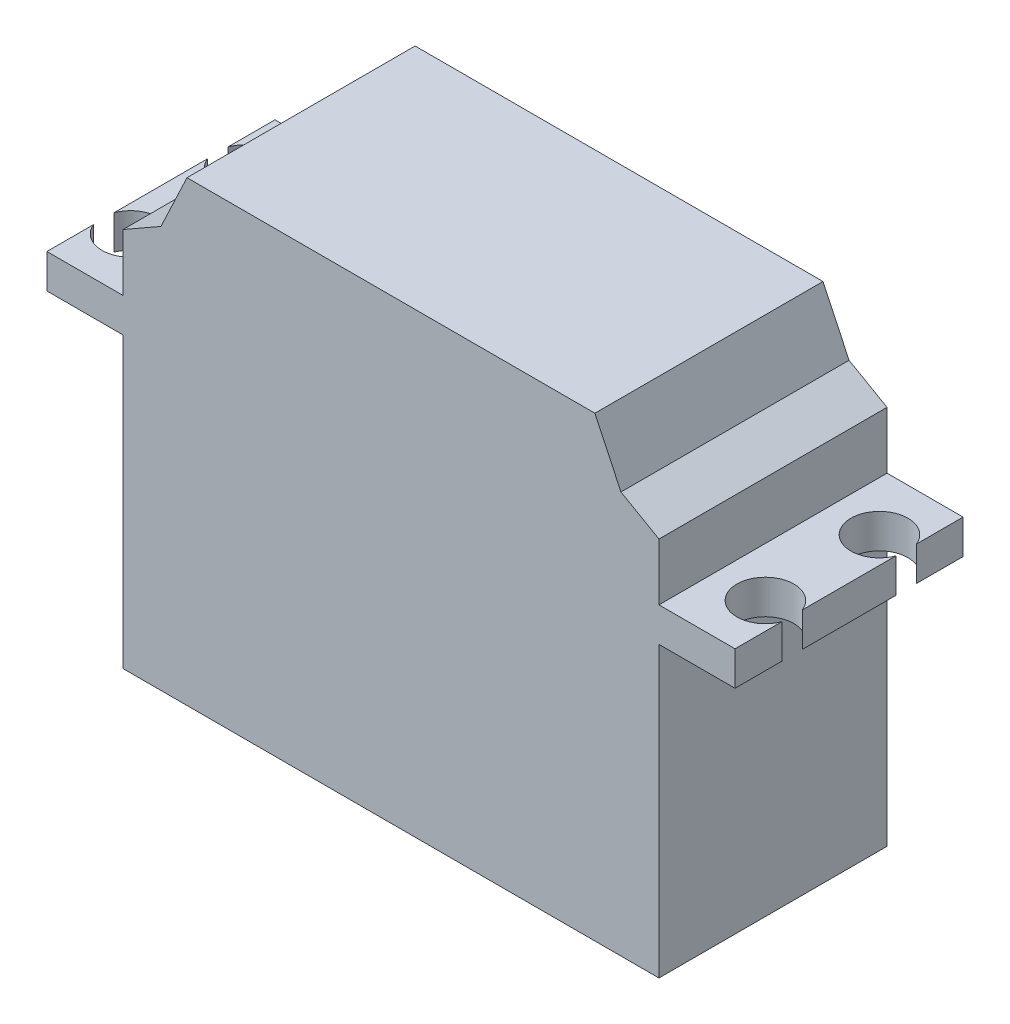
ISO-10303-21;
HEADER;
FILE_DESCRIPTION(('STEP AP214'),'2;1');
FILE_NAME('part.step','',(''),(''),'','','');
FILE_SCHEMA(('AUTOMOTIVE_DESIGN { 1 0 10303 214 1 1 1 1 }'));
ENDSEC;
DATA;
#1=APPLICATION_CONTEXT('core data for automotive mechanical design processes');
#2=APPLICATION_PROTOCOL_DEFINITION('international standard','automotive_design',2000,#1);
#3=PRODUCT_CONTEXT('',#1,'mechanical');
#4=PRODUCT('Part','Part','',(#3));
#5=PRODUCT_RELATED_PRODUCT_CATEGORY('part','',(#4));
#6=PRODUCT_DEFINITION_FORMATION('','',#4);
#7=PRODUCT_DEFINITION_CONTEXT('part definition',#1,'design');
#8=PRODUCT_DEFINITION('design','',#6,#7);
#9=PRODUCT_DEFINITION_SHAPE('','',#8);
#10=(LENGTH_UNIT() NAMED_UNIT(*) SI_UNIT(.MILLI.,.METRE.));
#11=(NAMED_UNIT(*) PLANE_ANGLE_UNIT() SI_UNIT($,.RADIAN.));
#12=(NAMED_UNIT(*) SI_UNIT($,.STERADIAN.) SOLID_ANGLE_UNIT());
#13=UNCERTAINTY_MEASURE_WITH_UNIT(LENGTH_MEASURE(1.E-05),#10,'distance_accuracy_value','');
#14=(GEOMETRIC_REPRESENTATION_CONTEXT(3) GLOBAL_UNCERTAINTY_ASSIGNED_CONTEXT((#13)) GLOBAL_UNIT_ASSIGNED_CONTEXT((#10,
#11,#12)) REPRESENTATION_CONTEXT('',''));
#15=CARTESIAN_POINT('',(0.,0.,0.));
#16=DIRECTION('',(0.,0.,1.));
#17=DIRECTION('',(1.,0.,0.));
#18=AXIS2_PLACEMENT_3D('',#15,#16,#17);
#19=CARTESIAN_POINT('',(-22.987,19.304,-13.1906548986632));
#20=DIRECTION('',(-1.,0.,0.));
#21=DIRECTION('',(0.,0.,1.));
#22=AXIS2_PLACEMENT_3D('',#19,#20,#21);
#23=PLANE('',#22);
#24=DIRECTION('',(0.,1.,0.));
#25=VECTOR('',#24,1.);
#26=CARTESIAN_POINT('',(-22.987,13.9158463273585,4.49391593050608));
#27=LINE('',#26,#25);
#28=CARTESIAN_POINT('',(-22.987,19.304,4.49391593050608));
#29=VERTEX_POINT('',#28);
#30=CARTESIAN_POINT('',(-22.987,21.59,4.49391593050608));
#31=VERTEX_POINT('',#30);
#32=EDGE_CURVE('E11',#29,#31,#27,.T.);
#33=ORIENTED_EDGE('',*,*,#32,.F.);
#34=DIRECTION('',(0.,0.,1.));
#35=VECTOR('',#34,1.);
#36=CARTESIAN_POINT('',(-22.987,19.304,-13.1906548986632));
#37=LINE('',#36,#35);
#38=CARTESIAN_POINT('',(-22.987,19.304,7.62));
#39=VERTEX_POINT('',#38);
#40=EDGE_CURVE('E261',#29,#39,#37,.T.);
#41=ORIENTED_EDGE('',*,*,#40,.T.);
#42=DIRECTION('',(0.,-1.,0.));
#43=VECTOR('',#42,1.);
#44=CARTESIAN_POINT('',(-22.987,19.304,7.62));
#45=LINE('',#44,#43);
#46=CARTESIAN_POINT('',(-22.987,21.59,7.62));
#47=VERTEX_POINT('',#46);
#48=EDGE_CURVE('E246',#47,#39,#45,.T.);
#49=ORIENTED_EDGE('',*,*,#48,.F.);
#50=DIRECTION('',(0.,0.,1.));
#51=VECTOR('',#50,1.);
#52=CARTESIAN_POINT('',(-22.987,21.59,-13.1906548986632));
#53=LINE('',#52,#51);
#54=EDGE_CURVE('E252',#31,#47,#53,.T.);
#55=ORIENTED_EDGE('',*,*,#54,.F.);
#56=EDGE_LOOP('',(#33,#41,#49,#55));
#57=FACE_BOUND('',#56,.T.);
#58=ADVANCED_FACE('F36',(#57),#23,.T.);
#59=DIRECTION('',(0.,1.,0.));
#60=VECTOR('',#59,1.);
#61=CARTESIAN_POINT('',(-22.987,13.9158463273585,3.12608406949392));
#62=LINE('',#61,#60);
#63=CARTESIAN_POINT('',(-22.987,21.59,3.12608406949392));
#64=VERTEX_POINT('',#63);
#65=CARTESIAN_POINT('',(-22.987,19.304,3.12608406949392));
#66=VERTEX_POINT('',#65);
#67=EDGE_CURVE('E44',#64,#66,#62,.F.);
#68=ORIENTED_EDGE('',*,*,#67,.F.);
#69=CARTESIAN_POINT('',(-22.987,21.59,-3.12608406949391));
#70=VERTEX_POINT('',#69);
#71=EDGE_CURVE('E265',#70,#64,#53,.T.);
#72=ORIENTED_EDGE('',*,*,#71,.F.);
#73=DIRECTION('',(0.,1.,0.));
#74=VECTOR('',#73,1.);
#75=CARTESIAN_POINT('',(-22.987,13.9158463273585,-3.12608406949391));
#76=LINE('',#75,#74);
#77=CARTESIAN_POINT('',(-22.987,19.304,-3.12608406949391));
#78=VERTEX_POINT('',#77);
#79=EDGE_CURVE('E340',#78,#70,#76,.T.);
#80=ORIENTED_EDGE('',*,*,#79,.F.);
#81=EDGE_CURVE('E260',#78,#66,#37,.T.);
#82=ORIENTED_EDGE('',*,*,#81,.T.);
#83=EDGE_LOOP('',(#68,#72,#80,#82));
#84=FACE_BOUND('',#83,.T.);
#85=ADVANCED_FACE('F356',(#84),#23,.T.);
#86=CARTESIAN_POINT('',(22.987,19.304,-13.1906548986632));
#87=DIRECTION('',(1.,0.,0.));
#88=DIRECTION('',(0.,0.,-1.));
#89=AXIS2_PLACEMENT_3D('',#86,#87,#88);
#90=PLANE('',#89);
#91=DIRECTION('',(0.,1.,0.));
#92=VECTOR('',#91,1.);
#93=CARTESIAN_POINT('',(22.987,13.9158463273585,-4.4939159305061));
#94=LINE('',#93,#92);
#95=CARTESIAN_POINT('',(22.987,19.304,-4.4939159305061));
#96=VERTEX_POINT('',#95);
#97=CARTESIAN_POINT('',(22.987,21.59,-4.4939159305061));
#98=VERTEX_POINT('',#97);
#99=EDGE_CURVE('E336',#96,#98,#94,.T.);
#100=ORIENTED_EDGE('',*,*,#99,.F.);
#101=DIRECTION('',(0.,0.,1.));
#102=VECTOR('',#101,1.);
#103=CARTESIAN_POINT('',(22.987,19.304,-13.1906548986632));
#104=LINE('',#103,#102);
#105=CARTESIAN_POINT('',(22.987,19.304,-7.62));
#106=VERTEX_POINT('',#105);
#107=EDGE_CURVE('E225',#106,#96,#104,.T.);
#108=ORIENTED_EDGE('',*,*,#107,.F.);
#109=DIRECTION('',(0.,-1.,0.));
#110=VECTOR('',#109,1.);
#111=CARTESIAN_POINT('',(22.987,19.304,-7.62));
#112=LINE('',#111,#110);
#113=CARTESIAN_POINT('',(22.987,21.59,-7.62));
#114=VERTEX_POINT('',#113);
#115=EDGE_CURVE('E233',#114,#106,#112,.T.);
#116=ORIENTED_EDGE('',*,*,#115,.F.);
#117=DIRECTION('',(0.,0.,1.));
#118=VECTOR('',#117,1.);
#119=CARTESIAN_POINT('',(22.987,21.59,-13.1906548986632));
#120=LINE('',#119,#118);
#121=EDGE_CURVE('E221',#114,#98,#120,.T.);
#122=ORIENTED_EDGE('',*,*,#121,.T.);
#123=EDGE_LOOP('',(#100,#108,#116,#122));
#124=FACE_BOUND('',#123,.T.);
#125=ADVANCED_FACE('F418',(#124),#90,.T.);
#126=DIRECTION('',(0.,1.,0.));
#127=VECTOR('',#126,1.);
#128=CARTESIAN_POINT('',(22.987,13.9158463273585,-3.12608406949393));
#129=LINE('',#128,#127);
#130=CARTESIAN_POINT('',(22.987,21.59,-3.12608406949393));
#131=VERTEX_POINT('',#130);
#132=CARTESIAN_POINT('',(22.987,19.304,-3.12608406949393));
#133=VERTEX_POINT('',#132);
#134=EDGE_CURVE('E206',#131,#133,#129,.F.);
#135=ORIENTED_EDGE('',*,*,#134,.F.);
#136=CARTESIAN_POINT('',(22.987,21.59,3.12608406949391));
#137=VERTEX_POINT('',#136);
#138=EDGE_CURVE('E214',#131,#137,#120,.T.);
#139=ORIENTED_EDGE('',*,*,#138,.T.);
#140=DIRECTION('',(0.,1.,0.));
#141=VECTOR('',#140,1.);
#142=CARTESIAN_POINT('',(22.987,13.9158463273585,3.12608406949391));
#143=LINE('',#142,#141);
#144=CARTESIAN_POINT('',(22.987,19.304,3.12608406949391));
#145=VERTEX_POINT('',#144);
#146=EDGE_CURVE('E195',#145,#137,#143,.T.);
#147=ORIENTED_EDGE('',*,*,#146,.F.);
#148=EDGE_CURVE('E231',#133,#145,#104,.T.);
#149=ORIENTED_EDGE('',*,*,#148,.F.);
#150=EDGE_LOOP('',(#135,#139,#147,#149));
#151=FACE_BOUND('',#150,.T.);
#152=ADVANCED_FACE('F220',(#151),#90,.T.);
#153=CARTESIAN_POINT('',(17.907,25.4,-7.62));
#154=DIRECTION('',(-1.,0.,0.));
#155=DIRECTION('',(0.,0.,1.));
#156=AXIS2_PLACEMENT_3D('',#153,#154,#155);
#157=PLANE('',#156);
#158=DIRECTION('',(0.,0.,1.));
#159=VECTOR('',#158,1.);
#160=CARTESIAN_POINT('',(17.907,21.59,-13.1906548986632));
#161=LINE('',#160,#159);
#162=CARTESIAN_POINT('',(17.907,21.59,-7.62));
#163=VERTEX_POINT('',#162);
#164=CARTESIAN_POINT('',(17.907,21.59,7.62));
#165=VERTEX_POINT('',#164);
#166=EDGE_CURVE('E224',#163,#165,#161,.T.);
#167=ORIENTED_EDGE('',*,*,#166,.F.);
#168=DIRECTION('',(0.,-1.,0.));
#169=VECTOR('',#168,1.);
#170=CARTESIAN_POINT('',(17.907,25.4,-7.62));
#171=LINE('',#170,#169);
#172=CARTESIAN_POINT('',(17.907,25.4,-7.62));
#173=VERTEX_POINT('',#172);
#174=EDGE_CURVE('E331',#173,#163,#171,.T.);
#175=ORIENTED_EDGE('',*,*,#174,.F.);
#176=DIRECTION('',(0.,0.,-1.));
#177=VECTOR('',#176,1.);
#178=CARTESIAN_POINT('',(17.907,25.4,-7.62));
#179=LINE('',#178,#177);
#180=CARTESIAN_POINT('',(17.907,25.4,7.62));
#181=VERTEX_POINT('',#180);
#182=EDGE_CURVE('E303',#181,#173,#179,.T.);
#183=ORIENTED_EDGE('',*,*,#182,.F.);
#184=DIRECTION('',(0.,-1.,0.));
#185=VECTOR('',#184,1.);
#186=CARTESIAN_POINT('',(17.907,25.4,7.62));
#187=LINE('',#186,#185);
#188=EDGE_CURVE('E321',#181,#165,#187,.T.);
#189=ORIENTED_EDGE('',*,*,#188,.T.);
#190=EDGE_LOOP('',(#167,#175,#183,#189));
#191=FACE_BOUND('',#190,.T.);
#192=ADVANCED_FACE('F422',(#191),#157,.F.);
#193=CARTESIAN_POINT('',(-17.907,25.4,-7.62));
#194=DIRECTION('',(1.,0.,0.));
#195=DIRECTION('',(0.,0.,-1.));
#196=AXIS2_PLACEMENT_3D('',#193,#194,#195);
#197=PLANE('',#196);
#198=DIRECTION('',(0.,0.,1.));
#199=VECTOR('',#198,1.);
#200=CARTESIAN_POINT('',(-17.907,19.304,-13.1906548986632));
#201=LINE('',#200,#199);
#202=CARTESIAN_POINT('',(-17.907,19.304,-7.62));
#203=VERTEX_POINT('',#202);
#204=CARTESIAN_POINT('',(-17.907,19.304,7.62));
#205=VERTEX_POINT('',#204);
#206=EDGE_CURVE('E254',#203,#205,#201,.T.);
#207=ORIENTED_EDGE('',*,*,#206,.F.);
#208=DIRECTION('',(0.,-1.,0.));
#209=VECTOR('',#208,1.);
#210=CARTESIAN_POINT('',(-17.907,25.4,-7.62));
#211=LINE('',#210,#209);
#212=CARTESIAN_POINT('',(-17.907,0.,-7.62));
#213=VERTEX_POINT('',#212);
#214=EDGE_CURVE('E327',#203,#213,#211,.T.);
#215=ORIENTED_EDGE('',*,*,#214,.T.);
#216=DIRECTION('',(0.,0.,1.));
#217=VECTOR('',#216,1.);
#218=CARTESIAN_POINT('',(-17.907,0.,-7.62));
#219=LINE('',#218,#217);
#220=CARTESIAN_POINT('',(-17.907,0.,7.62));
#221=VERTEX_POINT('',#220);
#222=EDGE_CURVE('E316',#213,#221,#219,.T.);
#223=ORIENTED_EDGE('',*,*,#222,.T.);
#224=DIRECTION('',(0.,-1.,0.));
#225=VECTOR('',#224,1.);
#226=CARTESIAN_POINT('',(-17.907,25.4,7.62));
#227=LINE('',#226,#225);
#228=EDGE_CURVE('E323',#205,#221,#227,.T.);
#229=ORIENTED_EDGE('',*,*,#228,.F.);
#230=EDGE_LOOP('',(#207,#215,#223,#229));
#231=FACE_BOUND('',#230,.T.);
#232=ADVANCED_FACE('F454',(#231),#197,.F.);
#233=CARTESIAN_POINT('',(17.907,19.304,-7.62));
#234=VERTEX_POINT('',#233);
#235=CARTESIAN_POINT('',(17.907,0.,-7.62));
#236=VERTEX_POINT('',#235);
#237=EDGE_CURVE('E330',#234,#236,#171,.T.);
#238=ORIENTED_EDGE('',*,*,#237,.F.);
#239=DIRECTION('',(0.,0.,1.));
#240=VECTOR('',#239,1.);
#241=CARTESIAN_POINT('',(17.907,19.304,-13.1906548986632));
#242=LINE('',#241,#240);
#243=CARTESIAN_POINT('',(17.907,19.304,7.62));
#244=VERTEX_POINT('',#243);
#245=EDGE_CURVE('E381',#234,#244,#242,.T.);
#246=ORIENTED_EDGE('',*,*,#245,.T.);
#247=CARTESIAN_POINT('',(17.907,0.,7.62));
#248=VERTEX_POINT('',#247);
#249=EDGE_CURVE('E310',#244,#248,#187,.T.);
#250=ORIENTED_EDGE('',*,*,#249,.T.);
#251=DIRECTION('',(0.,0.,-1.));
#252=VECTOR('',#251,1.);
#253=CARTESIAN_POINT('',(17.907,0.,-7.62));
#254=LINE('',#253,#252);
#255=EDGE_CURVE('E302',#248,#236,#254,.T.);
#256=ORIENTED_EDGE('',*,*,#255,.T.);
#257=EDGE_LOOP('',(#238,#246,#250,#256));
#258=FACE_BOUND('',#257,.T.);
#259=ADVANCED_FACE('F38',(#258),#157,.F.);
#260=CARTESIAN_POINT('',(-17.907,25.4,-7.62));
#261=DIRECTION('',(0.,0.,1.));
#262=DIRECTION('',(1.,0.,0.));
#263=AXIS2_PLACEMENT_3D('',#260,#261,#262);
#264=PLANE('',#263);
#265=DIRECTION('',(0.868243142124459,0.496138938356834,0.));
#266=VECTOR('',#265,1.);
#267=CARTESIAN_POINT('',(-17.907,25.4,-7.62));
#268=LINE('',#267,#266);
#269=CARTESIAN_POINT('',(-17.907,25.4,-7.62));
#270=VERTEX_POINT('',#269);
#271=CARTESIAN_POINT('',(-15.367,26.8514285714286,-7.62));
#272=VERTEX_POINT('',#271);
#273=EDGE_CURVE('E293',#270,#272,#268,.T.);
#274=ORIENTED_EDGE('',*,*,#273,.T.);
#275=DIRECTION('',(0.426649540613449,0.90441703295235,0.));
#276=VECTOR('',#275,1.);
#277=CARTESIAN_POINT('',(-15.367,26.8514285714286,-7.62));
#278=LINE('',#277,#276);
#279=CARTESIAN_POINT('',(-13.6268844552524,30.5401472694776,-7.62));
#280=VERTEX_POINT('',#279);
#281=EDGE_CURVE('E274',#272,#280,#278,.T.);
#282=ORIENTED_EDGE('',*,*,#281,.T.);
#283=DIRECTION('',(1.,0.,0.));
#284=VECTOR('',#283,1.);
#285=CARTESIAN_POINT('',(-13.6268844552524,30.5401472694776,-7.62));
#286=LINE('',#285,#284);
#287=CARTESIAN_POINT('',(13.6268844552524,30.5401472694776,-7.62));
#288=VERTEX_POINT('',#287);
#289=EDGE_CURVE('E271',#280,#288,#286,.T.);
#290=ORIENTED_EDGE('',*,*,#289,.T.);
#291=DIRECTION('',(0.426649540613449,-0.90441703295235,0.));
#292=VECTOR('',#291,1.);
#293=CARTESIAN_POINT('',(15.367,26.8514285714286,-7.62));
#294=LINE('',#293,#292);
#295=CARTESIAN_POINT('',(15.367,26.8514285714286,-7.62));
#296=VERTEX_POINT('',#295);
#297=EDGE_CURVE('E268',#288,#296,#294,.T.);
#298=ORIENTED_EDGE('',*,*,#297,.T.);
#299=DIRECTION('',(0.868243142124459,-0.496138938356834,0.));
#300=VECTOR('',#299,1.);
#301=CARTESIAN_POINT('',(9.017,30.48,-7.62));
#302=LINE('',#301,#300);
#303=EDGE_CURVE('E296',#296,#173,#302,.T.);
#304=ORIENTED_EDGE('',*,*,#303,.T.);
#305=ORIENTED_EDGE('',*,*,#174,.T.);
#306=DIRECTION('',(1.,0.,0.));
#307=VECTOR('',#306,1.);
#308=CARTESIAN_POINT('',(22.987,21.59,-7.62));
#309=LINE('',#308,#307);
#310=EDGE_CURVE('E379',#163,#114,#309,.T.);
#311=ORIENTED_EDGE('',*,*,#310,.T.);
#312=ORIENTED_EDGE('',*,*,#115,.T.);
#313=DIRECTION('',(-1.,0.,0.));
#314=VECTOR('',#313,1.);
#315=CARTESIAN_POINT('',(17.907,19.304,-7.62));
#316=LINE('',#315,#314);
#317=EDGE_CURVE('E236',#106,#234,#316,.T.);
#318=ORIENTED_EDGE('',*,*,#317,.T.);
#319=ORIENTED_EDGE('',*,*,#237,.T.);
#320=DIRECTION('',(-1.,0.,0.));
#321=VECTOR('',#320,1.);
#322=CARTESIAN_POINT('',(-17.907,0.,-7.62));
#323=LINE('',#322,#321);
#324=EDGE_CURVE('E313',#236,#213,#323,.T.);
#325=ORIENTED_EDGE('',*,*,#324,.T.);
#326=ORIENTED_EDGE('',*,*,#214,.F.);
#327=DIRECTION('',(-1.,0.,0.));
#328=VECTOR('',#327,1.);
#329=CARTESIAN_POINT('',(-17.907,19.304,-7.62));
#330=LINE('',#329,#328);
#331=CARTESIAN_POINT('',(-22.987,19.304,-7.62));
#332=VERTEX_POINT('',#331);
#333=EDGE_CURVE('E237',#203,#332,#330,.T.);
#334=ORIENTED_EDGE('',*,*,#333,.T.);
#335=DIRECTION('',(0.,1.,0.));
#336=VECTOR('',#335,1.);
#337=CARTESIAN_POINT('',(-22.987,19.304,-7.62));
#338=LINE('',#337,#336);
#339=CARTESIAN_POINT('',(-22.987,21.59,-7.62));
#340=VERTEX_POINT('',#339);
#341=EDGE_CURVE('E243',#332,#340,#338,.T.);
#342=ORIENTED_EDGE('',*,*,#341,.T.);
#343=DIRECTION('',(1.,0.,0.));
#344=VECTOR('',#343,1.);
#345=CARTESIAN_POINT('',(-22.987,21.59,-7.62));
#346=LINE('',#345,#344);
#347=CARTESIAN_POINT('',(-17.907,21.59,-7.62));
#348=VERTEX_POINT('',#347);
#349=EDGE_CURVE('E239',#340,#348,#346,.T.);
#350=ORIENTED_EDGE('',*,*,#349,.T.);
#351=EDGE_CURVE('E328',#270,#348,#211,.T.);
#352=ORIENTED_EDGE('',*,*,#351,.F.);
#353=EDGE_LOOP('',(#274,#282,#290,#298,#304,#305,#311,#312,#318,#319,#325,#326,#334,#342,#350,#352));
#354=FACE_BOUND('',#353,.T.);
#355=ADVANCED_FACE('F420',(#354),#264,.F.);
#356=ORIENTED_EDGE('',*,*,#351,.T.);
#357=DIRECTION('',(0.,0.,1.));
#358=VECTOR('',#357,1.);
#359=CARTESIAN_POINT('',(-17.907,21.59,-13.1906548986632));
#360=LINE('',#359,#358);
#361=CARTESIAN_POINT('',(-17.907,21.59,7.62));
#362=VERTEX_POINT('',#361);
#363=EDGE_CURVE('E240',#348,#362,#360,.T.);
#364=ORIENTED_EDGE('',*,*,#363,.T.);
#365=CARTESIAN_POINT('',(-17.907,25.4,7.62));
#366=VERTEX_POINT('',#365);
#367=EDGE_CURVE('E324',#366,#362,#227,.T.);
#368=ORIENTED_EDGE('',*,*,#367,.F.);
#369=DIRECTION('',(0.,0.,1.));
#370=VECTOR('',#369,1.);
#371=CARTESIAN_POINT('',(-17.907,25.4,-7.62));
#372=LINE('',#371,#370);
#373=EDGE_CURVE('E306',#270,#366,#372,.T.);
#374=ORIENTED_EDGE('',*,*,#373,.F.);
#375=EDGE_LOOP('',(#356,#364,#368,#374));
#376=FACE_BOUND('',#375,.T.);
#377=ADVANCED_FACE('F444',(#376),#197,.F.);
#378=CARTESIAN_POINT('',(-17.907,25.4,7.62));
#379=DIRECTION('',(0.,0.,-1.));
#380=DIRECTION('',(-1.,0.,0.));
#381=AXIS2_PLACEMENT_3D('',#378,#379,#380);
#382=PLANE('',#381);
#383=DIRECTION('',(-0.426649540613449,-0.90441703295235,0.));
#384=VECTOR('',#383,1.);
#385=CARTESIAN_POINT('',(-15.367,26.8514285714286,7.62));
#386=LINE('',#385,#384);
#387=CARTESIAN_POINT('',(-13.6268844552524,30.5401472694776,7.62));
#388=VERTEX_POINT('',#387);
#389=CARTESIAN_POINT('',(-15.367,26.8514285714286,7.62));
#390=VERTEX_POINT('',#389);
#391=EDGE_CURVE('E282',#388,#390,#386,.T.);
#392=ORIENTED_EDGE('',*,*,#391,.T.);
#393=DIRECTION('',(-0.868243142124459,-0.496138938356834,0.));
#394=VECTOR('',#393,1.);
#395=CARTESIAN_POINT('',(-17.907,25.4,7.62));
#396=LINE('',#395,#394);
#397=EDGE_CURVE('E297',#390,#366,#396,.T.);
#398=ORIENTED_EDGE('',*,*,#397,.T.);
#399=ORIENTED_EDGE('',*,*,#367,.T.);
#400=DIRECTION('',(-1.,0.,0.));
#401=VECTOR('',#400,1.);
#402=CARTESIAN_POINT('',(-22.987,21.59,7.62));
#403=LINE('',#402,#401);
#404=EDGE_CURVE('E235',#362,#47,#403,.T.);
#405=ORIENTED_EDGE('',*,*,#404,.T.);
#406=ORIENTED_EDGE('',*,*,#48,.T.);
#407=DIRECTION('',(1.,0.,0.));
#408=VECTOR('',#407,1.);
#409=CARTESIAN_POINT('',(-17.907,19.304,7.62));
#410=LINE('',#409,#408);
#411=EDGE_CURVE('E249',#39,#205,#410,.T.);
#412=ORIENTED_EDGE('',*,*,#411,.T.);
#413=ORIENTED_EDGE('',*,*,#228,.T.);
#414=DIRECTION('',(1.,0.,0.));
#415=VECTOR('',#414,1.);
#416=CARTESIAN_POINT('',(-17.907,0.,7.62));
#417=LINE('',#416,#415);
#418=EDGE_CURVE('E307',#221,#248,#417,.T.);
#419=ORIENTED_EDGE('',*,*,#418,.T.);
#420=ORIENTED_EDGE('',*,*,#249,.F.);
#421=DIRECTION('',(1.,0.,0.));
#422=VECTOR('',#421,1.);
#423=CARTESIAN_POINT('',(17.907,19.304,7.62));
#424=LINE('',#423,#422);
#425=CARTESIAN_POINT('',(22.987,19.304,7.62));
#426=VERTEX_POINT('',#425);
#427=EDGE_CURVE('E372',#244,#426,#424,.T.);
#428=ORIENTED_EDGE('',*,*,#427,.T.);
#429=DIRECTION('',(0.,1.,0.));
#430=VECTOR('',#429,1.);
#431=CARTESIAN_POINT('',(22.987,19.304,7.62));
#432=LINE('',#431,#430);
#433=CARTESIAN_POINT('',(22.987,21.59,7.62));
#434=VERTEX_POINT('',#433);
#435=EDGE_CURVE('E386',#426,#434,#432,.T.);
#436=ORIENTED_EDGE('',*,*,#435,.T.);
#437=DIRECTION('',(-1.,0.,0.));
#438=VECTOR('',#437,1.);
#439=CARTESIAN_POINT('',(22.987,21.59,7.62));
#440=LINE('',#439,#438);
#441=EDGE_CURVE('E389',#434,#165,#440,.T.);
#442=ORIENTED_EDGE('',*,*,#441,.T.);
#443=ORIENTED_EDGE('',*,*,#188,.F.);
#444=DIRECTION('',(-0.868243142124459,0.496138938356834,0.));
#445=VECTOR('',#444,1.);
#446=CARTESIAN_POINT('',(9.017,30.48,7.62));
#447=LINE('',#446,#445);
#448=CARTESIAN_POINT('',(15.367,26.8514285714286,7.62));
#449=VERTEX_POINT('',#448);
#450=EDGE_CURVE('E276',#181,#449,#447,.T.);
#451=ORIENTED_EDGE('',*,*,#450,.T.);
#452=DIRECTION('',(-0.426649540613449,0.90441703295235,0.));
#453=VECTOR('',#452,1.);
#454=CARTESIAN_POINT('',(15.367,26.8514285714286,7.62));
#455=LINE('',#454,#453);
#456=CARTESIAN_POINT('',(13.6268844552524,30.5401472694776,7.62));
#457=VERTEX_POINT('',#456);
#458=EDGE_CURVE('E267',#449,#457,#455,.T.);
#459=ORIENTED_EDGE('',*,*,#458,.T.);
#460=DIRECTION('',(-1.,0.,0.));
#461=VECTOR('',#460,1.);
#462=CARTESIAN_POINT('',(-13.6268844552524,30.5401472694776,7.62));
#463=LINE('',#462,#461);
#464=EDGE_CURVE('E279',#457,#388,#463,.T.);
#465=ORIENTED_EDGE('',*,*,#464,.T.);
#466=EDGE_LOOP('',(#392,#398,#399,#405,#406,#412,#413,#419,#420,#428,#436,#442,#443,#451,#459,#465));
#467=FACE_BOUND('',#466,.T.);
#468=ADVANCED_FACE('F362',(#467),#382,.F.);
#469=CARTESIAN_POINT('',(0.,0.,0.));
#470=DIRECTION('',(0.,1.,0.));
#471=DIRECTION('',(0.,0.,1.));
#472=AXIS2_PLACEMENT_3D('',#469,#470,#471);
#473=PLANE('',#472);
#474=ORIENTED_EDGE('',*,*,#255,.F.);
#475=ORIENTED_EDGE('',*,*,#418,.F.);
#476=ORIENTED_EDGE('',*,*,#222,.F.);
#477=ORIENTED_EDGE('',*,*,#324,.F.);
#478=EDGE_LOOP('',(#474,#475,#476,#477));
#479=FACE_BOUND('',#478,.T.);
#480=ADVANCED_FACE('F458',(#479),#473,.F.);
#481=CARTESIAN_POINT('',(-17.907,25.4,-43.7924894913248));
#482=DIRECTION('',(-0.496138938356834,0.868243142124459,0.));
#483=DIRECTION('',(-0.868243142124459,-0.496138938356834,0.));
#484=AXIS2_PLACEMENT_3D('',#481,#482,#483);
#485=PLANE('',#484);
#486=DIRECTION('',(0.,0.,1.));
#487=VECTOR('',#486,1.);
#488=CARTESIAN_POINT('',(-15.367,26.8514285714286,-38.5745699636312));
#489=LINE('',#488,#487);
#490=EDGE_CURVE('E272',#272,#390,#489,.T.);
#491=ORIENTED_EDGE('',*,*,#490,.F.);
#492=ORIENTED_EDGE('',*,*,#273,.F.);
#493=ORIENTED_EDGE('',*,*,#373,.T.);
#494=ORIENTED_EDGE('',*,*,#397,.F.);
#495=EDGE_LOOP('',(#491,#492,#493,#494));
#496=FACE_BOUND('',#495,.T.);
#497=ADVANCED_FACE('F440',(#496),#485,.T.);
#498=CARTESIAN_POINT('',(9.017,30.48,-43.7924894913248));
#499=DIRECTION('',(0.496138938356834,0.868243142124459,0.));
#500=DIRECTION('',(-0.868243142124459,0.496138938356834,0.));
#501=AXIS2_PLACEMENT_3D('',#498,#499,#500);
#502=PLANE('',#501);
#503=DIRECTION('',(0.,0.,1.));
#504=VECTOR('',#503,1.);
#505=CARTESIAN_POINT('',(15.367,26.8514285714286,-38.5745699636312));
#506=LINE('',#505,#504);
#507=EDGE_CURVE('E285',#296,#449,#506,.T.);
#508=ORIENTED_EDGE('',*,*,#507,.T.);
#509=ORIENTED_EDGE('',*,*,#450,.F.);
#510=ORIENTED_EDGE('',*,*,#182,.T.);
#511=ORIENTED_EDGE('',*,*,#303,.F.);
#512=EDGE_LOOP('',(#508,#509,#510,#511));
#513=FACE_BOUND('',#512,.T.);
#514=ADVANCED_FACE('F424',(#513),#502,.T.);
#515=CARTESIAN_POINT('',(-15.367,26.8514285714286,-38.5745699636312));
#516=DIRECTION('',(-0.90441703295235,0.426649540613449,0.));
#517=DIRECTION('',(-0.426649540613449,-0.90441703295235,0.));
#518=AXIS2_PLACEMENT_3D('',#515,#516,#517);
#519=PLANE('',#518);
#520=ORIENTED_EDGE('',*,*,#281,.F.);
#521=ORIENTED_EDGE('',*,*,#490,.T.);
#522=ORIENTED_EDGE('',*,*,#391,.F.);
#523=DIRECTION('',(0.,0.,1.));
#524=VECTOR('',#523,1.);
#525=CARTESIAN_POINT('',(-13.6268844552524,30.5401472694776,-38.5745699636312));
#526=LINE('',#525,#524);
#527=EDGE_CURVE('E287',#280,#388,#526,.T.);
#528=ORIENTED_EDGE('',*,*,#527,.F.);
#529=EDGE_LOOP('',(#520,#521,#522,#528));
#530=FACE_BOUND('',#529,.T.);
#531=ADVANCED_FACE('F436',(#530),#519,.T.);
#532=CARTESIAN_POINT('',(-13.6268844552524,30.5401472694776,-38.5745699636312));
#533=DIRECTION('',(0.,1.,0.));
#534=DIRECTION('',(0.,0.,1.));
#535=AXIS2_PLACEMENT_3D('',#532,#533,#534);
#536=PLANE('',#535);
#537=ORIENTED_EDGE('',*,*,#289,.F.);
#538=ORIENTED_EDGE('',*,*,#527,.T.);
#539=ORIENTED_EDGE('',*,*,#464,.F.);
#540=DIRECTION('',(0.,0.,1.));
#541=VECTOR('',#540,1.);
#542=CARTESIAN_POINT('',(13.6268844552524,30.5401472694776,-38.5745699636312));
#543=LINE('',#542,#541);
#544=EDGE_CURVE('E289',#288,#457,#543,.T.);
#545=ORIENTED_EDGE('',*,*,#544,.F.);
#546=EDGE_LOOP('',(#537,#538,#539,#545));
#547=FACE_BOUND('',#546,.T.);
#548=ADVANCED_FACE('F433',(#547),#536,.T.);
#549=CARTESIAN_POINT('',(15.367,26.8514285714286,-38.5745699636312));
#550=DIRECTION('',(0.90441703295235,0.426649540613449,0.));
#551=DIRECTION('',(-0.426649540613449,0.90441703295235,0.));
#552=AXIS2_PLACEMENT_3D('',#549,#550,#551);
#553=PLANE('',#552);
#554=ORIENTED_EDGE('',*,*,#297,.F.);
#555=ORIENTED_EDGE('',*,*,#544,.T.);
#556=ORIENTED_EDGE('',*,*,#458,.F.);
#557=ORIENTED_EDGE('',*,*,#507,.F.);
#558=EDGE_LOOP('',(#554,#555,#556,#557));
#559=FACE_BOUND('',#558,.T.);
#560=ADVANCED_FACE('F429',(#559),#553,.T.);
#561=CARTESIAN_POINT('',(-22.987,21.59,-13.1906548986632));
#562=DIRECTION('',(0.,1.,0.));
#563=DIRECTION('',(0.,0.,1.));
#564=AXIS2_PLACEMENT_3D('',#561,#562,#563);
#565=PLANE('',#564);
#566=CARTESIAN_POINT('',(-21.209,21.59,3.81));
#567=DIRECTION('',(0.,1.,0.));
#568=DIRECTION('',(0.,0.,-1.));
#569=AXIS2_PLACEMENT_3D('',#566,#567,#568);
#570=CIRCLE('',#569,1.905);
#571=EDGE_CURVE('E50',#31,#64,#570,.T.);
#572=ORIENTED_EDGE('',*,*,#571,.F.);
#573=ORIENTED_EDGE('',*,*,#54,.T.);
#574=ORIENTED_EDGE('',*,*,#404,.F.);
#575=ORIENTED_EDGE('',*,*,#363,.F.);
#576=ORIENTED_EDGE('',*,*,#349,.F.);
#577=CARTESIAN_POINT('',(-22.987,21.59,-4.49391593050609));
#578=VERTEX_POINT('',#577);
#579=EDGE_CURVE('E262',#340,#578,#53,.T.);
#580=ORIENTED_EDGE('',*,*,#579,.T.);
#581=CARTESIAN_POINT('',(-21.209,21.59,-3.81));
#582=DIRECTION('',(0.,1.,0.));
#583=DIRECTION('',(0.,0.,1.));
#584=AXIS2_PLACEMENT_3D('',#581,#582,#583);
#585=CIRCLE('',#584,1.905);
#586=EDGE_CURVE('E58',#70,#578,#585,.T.);
#587=ORIENTED_EDGE('',*,*,#586,.F.);
#588=ORIENTED_EDGE('',*,*,#71,.T.);
#589=EDGE_LOOP('',(#572,#573,#574,#575,#576,#580,#587,#588));
#590=FACE_BOUND('',#589,.T.);
#591=ADVANCED_FACE('F367',(#590),#565,.T.);
#592=CARTESIAN_POINT('',(-17.907,19.304,-13.1906548986632));
#593=DIRECTION('',(0.,-1.,0.));
#594=DIRECTION('',(0.,0.,-1.));
#595=AXIS2_PLACEMENT_3D('',#592,#593,#594);
#596=PLANE('',#595);
#597=CARTESIAN_POINT('',(-21.209,19.304,3.81));
#598=DIRECTION('',(0.,-1.,0.));
#599=DIRECTION('',(0.,0.,-1.));
#600=AXIS2_PLACEMENT_3D('',#597,#598,#599);
#601=CIRCLE('',#600,1.905);
#602=EDGE_CURVE('E217',#29,#66,#601,.F.);
#603=ORIENTED_EDGE('',*,*,#602,.T.);
#604=ORIENTED_EDGE('',*,*,#81,.F.);
#605=CARTESIAN_POINT('',(-21.209,19.304,-3.81));
#606=DIRECTION('',(0.,-1.,0.));
#607=DIRECTION('',(0.,0.,-1.));
#608=AXIS2_PLACEMENT_3D('',#605,#606,#607);
#609=CIRCLE('',#608,1.905);
#610=CARTESIAN_POINT('',(-22.987,19.304,-4.49391593050609));
#611=VERTEX_POINT('',#610);
#612=EDGE_CURVE('E370',#78,#611,#609,.F.);
#613=ORIENTED_EDGE('',*,*,#612,.T.);
#614=EDGE_CURVE('E257',#332,#611,#37,.T.);
#615=ORIENTED_EDGE('',*,*,#614,.F.);
#616=ORIENTED_EDGE('',*,*,#333,.F.);
#617=ORIENTED_EDGE('',*,*,#206,.T.);
#618=ORIENTED_EDGE('',*,*,#411,.F.);
#619=ORIENTED_EDGE('',*,*,#40,.F.);
#620=EDGE_LOOP('',(#603,#604,#613,#615,#616,#617,#618,#619));
#621=FACE_BOUND('',#620,.T.);
#622=ADVANCED_FACE('F351',(#621),#596,.T.);
#623=DIRECTION('',(0.,1.,0.));
#624=VECTOR('',#623,1.);
#625=CARTESIAN_POINT('',(-22.987,13.9158463273585,-4.49391593050609));
#626=LINE('',#625,#624);
#627=EDGE_CURVE('E338',#578,#611,#626,.F.);
#628=ORIENTED_EDGE('',*,*,#627,.F.);
#629=ORIENTED_EDGE('',*,*,#579,.F.);
#630=ORIENTED_EDGE('',*,*,#341,.F.);
#631=ORIENTED_EDGE('',*,*,#614,.T.);
#632=EDGE_LOOP('',(#628,#629,#630,#631));
#633=FACE_BOUND('',#632,.T.);
#634=ADVANCED_FACE('F447',(#633),#23,.T.);
#635=CARTESIAN_POINT('',(17.907,19.304,-13.1906548986632));
#636=DIRECTION('',(0.,-1.,0.));
#637=DIRECTION('',(1.,0.,0.));
#638=AXIS2_PLACEMENT_3D('',#635,#636,#637);
#639=PLANE('',#638);
#640=CARTESIAN_POINT('',(21.209,19.304,-3.81000000000001));
#641=DIRECTION('',(0.,-1.,0.));
#642=DIRECTION('',(0.,0.,-1.));
#643=AXIS2_PLACEMENT_3D('',#640,#641,#642);
#644=CIRCLE('',#643,1.905);
#645=EDGE_CURVE('E376',#96,#133,#644,.F.);
#646=ORIENTED_EDGE('',*,*,#645,.T.);
#647=ORIENTED_EDGE('',*,*,#148,.T.);
#648=CARTESIAN_POINT('',(21.209,19.304,3.80999999999999));
#649=DIRECTION('',(0.,-1.,0.));
#650=DIRECTION('',(0.,0.,-1.));
#651=AXIS2_PLACEMENT_3D('',#648,#649,#650);
#652=CIRCLE('',#651,1.905);
#653=CARTESIAN_POINT('',(22.987,19.304,4.49391593050606));
#654=VERTEX_POINT('',#653);
#655=EDGE_CURVE('E201',#145,#654,#652,.F.);
#656=ORIENTED_EDGE('',*,*,#655,.T.);
#657=EDGE_CURVE('E232',#654,#426,#104,.T.);
#658=ORIENTED_EDGE('',*,*,#657,.T.);
#659=ORIENTED_EDGE('',*,*,#427,.F.);
#660=ORIENTED_EDGE('',*,*,#245,.F.);
#661=ORIENTED_EDGE('',*,*,#317,.F.);
#662=ORIENTED_EDGE('',*,*,#107,.T.);
#663=EDGE_LOOP('',(#646,#647,#656,#658,#659,#660,#661,#662));
#664=FACE_BOUND('',#663,.T.);
#665=ADVANCED_FACE('F408',(#664),#639,.T.);
#666=CARTESIAN_POINT('',(22.987,21.59,-13.1906548986632));
#667=DIRECTION('',(0.,1.,0.));
#668=DIRECTION('',(-1.,0.,0.));
#669=AXIS2_PLACEMENT_3D('',#666,#667,#668);
#670=PLANE('',#669);
#671=CARTESIAN_POINT('',(21.209,21.59,-3.81000000000001));
#672=DIRECTION('',(0.,1.,0.));
#673=DIRECTION('',(0.,0.,-1.));
#674=AXIS2_PLACEMENT_3D('',#671,#672,#673);
#675=CIRCLE('',#674,1.905);
#676=EDGE_CURVE('E413',#98,#131,#675,.T.);
#677=ORIENTED_EDGE('',*,*,#676,.F.);
#678=ORIENTED_EDGE('',*,*,#121,.F.);
#679=ORIENTED_EDGE('',*,*,#310,.F.);
#680=ORIENTED_EDGE('',*,*,#166,.T.);
#681=ORIENTED_EDGE('',*,*,#441,.F.);
#682=CARTESIAN_POINT('',(22.987,21.59,4.49391593050606));
#683=VERTEX_POINT('',#682);
#684=EDGE_CURVE('E216',#683,#434,#120,.T.);
#685=ORIENTED_EDGE('',*,*,#684,.F.);
#686=CARTESIAN_POINT('',(21.209,21.59,3.80999999999999));
#687=DIRECTION('',(0.,1.,0.));
#688=DIRECTION('',(0.,0.,1.));
#689=AXIS2_PLACEMENT_3D('',#686,#687,#688);
#690=CIRCLE('',#689,1.905);
#691=EDGE_CURVE('E198',#137,#683,#690,.T.);
#692=ORIENTED_EDGE('',*,*,#691,.F.);
#693=ORIENTED_EDGE('',*,*,#138,.F.);
#694=EDGE_LOOP('',(#677,#678,#679,#680,#681,#685,#692,#693));
#695=FACE_BOUND('',#694,.T.);
#696=ADVANCED_FACE('F213',(#695),#670,.T.);
#697=DIRECTION('',(0.,1.,0.));
#698=VECTOR('',#697,1.);
#699=CARTESIAN_POINT('',(22.987,13.9158463273585,4.49391593050606));
#700=LINE('',#699,#698);
#701=EDGE_CURVE('E207',#683,#654,#700,.F.);
#702=ORIENTED_EDGE('',*,*,#701,.F.);
#703=ORIENTED_EDGE('',*,*,#684,.T.);
#704=ORIENTED_EDGE('',*,*,#435,.F.);
#705=ORIENTED_EDGE('',*,*,#657,.F.);
#706=EDGE_LOOP('',(#702,#703,#704,#705));
#707=FACE_BOUND('',#706,.T.);
#708=ADVANCED_FACE('F405',(#707),#90,.T.);
#709=CARTESIAN_POINT('',(21.209,13.9158463273585,3.80999999999999));
#710=DIRECTION('',(0.,1.,0.));
#711=DIRECTION('',(0.,0.,1.));
#712=AXIS2_PLACEMENT_3D('',#709,#710,#711);
#713=CYLINDRICAL_SURFACE('',#712,1.905);
#714=ORIENTED_EDGE('',*,*,#146,.T.);
#715=ORIENTED_EDGE('',*,*,#691,.T.);
#716=ORIENTED_EDGE('',*,*,#701,.T.);
#717=ORIENTED_EDGE('',*,*,#655,.F.);
#718=EDGE_LOOP('',(#714,#715,#716,#717));
#719=FACE_BOUND('',#718,.T.);
#720=ADVANCED_FACE('F197',(#719),#713,.F.);
#721=CARTESIAN_POINT('',(21.209,13.9158463273585,-3.81000000000001));
#722=DIRECTION('',(0.,1.,0.));
#723=DIRECTION('',(0.,0.,1.));
#724=AXIS2_PLACEMENT_3D('',#721,#722,#723);
#725=CYLINDRICAL_SURFACE('',#724,1.905);
#726=ORIENTED_EDGE('',*,*,#99,.T.);
#727=ORIENTED_EDGE('',*,*,#676,.T.);
#728=ORIENTED_EDGE('',*,*,#134,.T.);
#729=ORIENTED_EDGE('',*,*,#645,.F.);
#730=EDGE_LOOP('',(#726,#727,#728,#729));
#731=FACE_BOUND('',#730,.T.);
#732=ADVANCED_FACE('F415',(#731),#725,.F.);
#733=CARTESIAN_POINT('',(-21.209,13.9158463273585,-3.81));
#734=DIRECTION('',(0.,1.,0.));
#735=DIRECTION('',(0.,0.,1.));
#736=AXIS2_PLACEMENT_3D('',#733,#734,#735);
#737=CYLINDRICAL_SURFACE('',#736,1.905);
#738=ORIENTED_EDGE('',*,*,#79,.T.);
#739=ORIENTED_EDGE('',*,*,#586,.T.);
#740=ORIENTED_EDGE('',*,*,#627,.T.);
#741=ORIENTED_EDGE('',*,*,#612,.F.);
#742=EDGE_LOOP('',(#738,#739,#740,#741));
#743=FACE_BOUND('',#742,.T.);
#744=ADVANCED_FACE('F449',(#743),#737,.F.);
#745=CARTESIAN_POINT('',(-21.209,13.9158463273585,3.81));
#746=DIRECTION('',(0.,1.,0.));
#747=DIRECTION('',(0.,0.,1.));
#748=AXIS2_PLACEMENT_3D('',#745,#746,#747);
#749=CYLINDRICAL_SURFACE('',#748,1.905);
#750=ORIENTED_EDGE('',*,*,#32,.T.);
#751=ORIENTED_EDGE('',*,*,#571,.T.);
#752=ORIENTED_EDGE('',*,*,#67,.T.);
#753=ORIENTED_EDGE('',*,*,#602,.F.);
#754=EDGE_LOOP('',(#750,#751,#752,#753));
#755=FACE_BOUND('',#754,.T.);
#756=ADVANCED_FACE('F342',(#755),#749,.F.);
#757=CLOSED_SHELL('',(#58,#85,#125,#152,#192,#232,#259,#355,#377,#468,#480,#497,#514,#531,#548,
#560,#591,#622,#634,#665,#696,#708,#720,#732,#744,#756));
#758=MANIFOLD_SOLID_BREP('B2',#757);
#759=ADVANCED_BREP_SHAPE_REPRESENTATION('',(#18,#758),#14);
#760=SHAPE_DEFINITION_REPRESENTATION(#9,#759);
ENDSEC;
END-ISO-10303-21;
